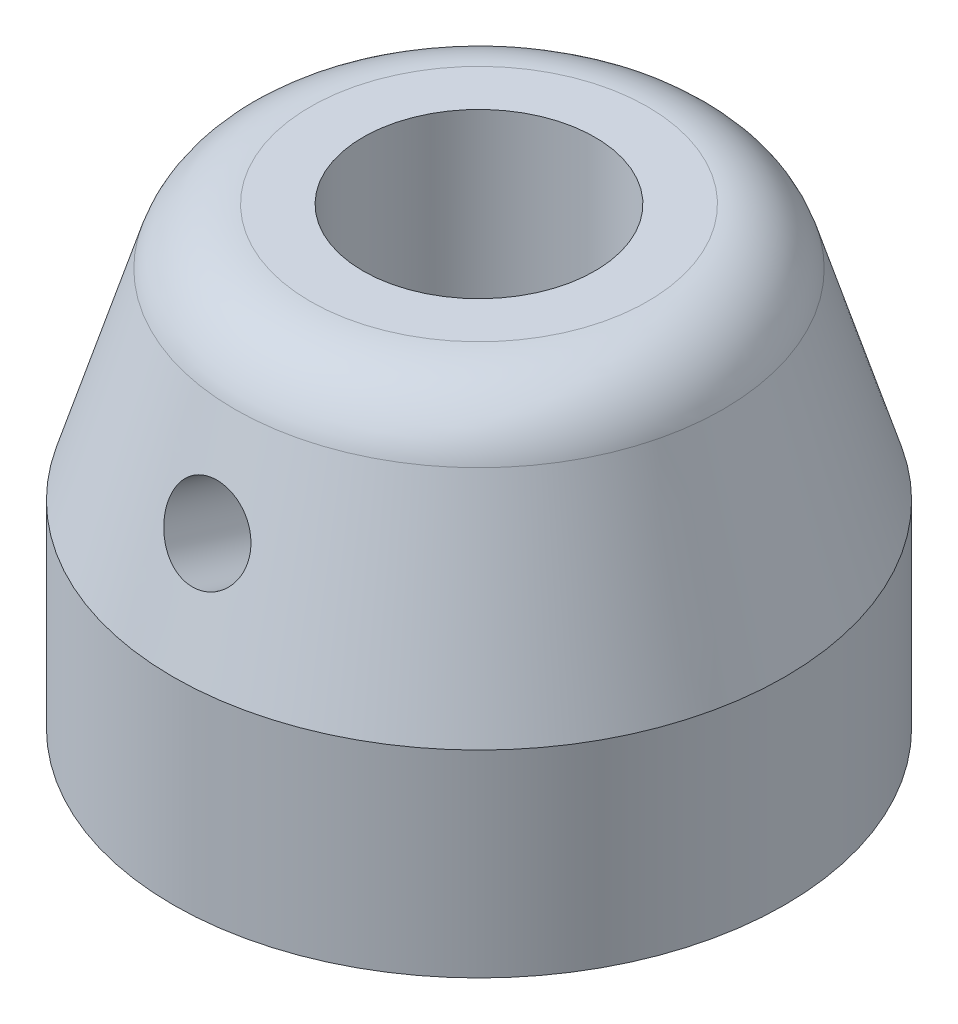
ISO-10303-21;
HEADER;
FILE_DESCRIPTION(('STEP AP214'),'2;1');
FILE_NAME('part.step','',(''),(''),'','','');
FILE_SCHEMA(('AUTOMOTIVE_DESIGN { 1 0 10303 214 1 1 1 1 }'));
ENDSEC;
DATA;
#1=APPLICATION_CONTEXT('core data for automotive mechanical design processes');
#2=APPLICATION_PROTOCOL_DEFINITION('international standard','automotive_design',2000,#1);
#3=PRODUCT_CONTEXT('',#1,'mechanical');
#4=PRODUCT('Part','Part','',(#3));
#5=PRODUCT_RELATED_PRODUCT_CATEGORY('part','',(#4));
#6=PRODUCT_DEFINITION_FORMATION('','',#4);
#7=PRODUCT_DEFINITION_CONTEXT('part definition',#1,'design');
#8=PRODUCT_DEFINITION('design','',#6,#7);
#9=PRODUCT_DEFINITION_SHAPE('','',#8);
#10=(LENGTH_UNIT() NAMED_UNIT(*) SI_UNIT(.MILLI.,.METRE.));
#11=(NAMED_UNIT(*) PLANE_ANGLE_UNIT() SI_UNIT($,.RADIAN.));
#12=(NAMED_UNIT(*) SI_UNIT($,.STERADIAN.) SOLID_ANGLE_UNIT());
#13=UNCERTAINTY_MEASURE_WITH_UNIT(LENGTH_MEASURE(1.E-05),#10,'distance_accuracy_value','');
#14=(GEOMETRIC_REPRESENTATION_CONTEXT(3) GLOBAL_UNCERTAINTY_ASSIGNED_CONTEXT((#13)) GLOBAL_UNIT_ASSIGNED_CONTEXT((#10,
#11,#12)) REPRESENTATION_CONTEXT('',''));
#15=CARTESIAN_POINT('',(0.,0.,0.));
#16=DIRECTION('',(0.,0.,1.));
#17=DIRECTION('',(1.,0.,0.));
#18=AXIS2_PLACEMENT_3D('',#15,#16,#17);
#19=CARTESIAN_POINT('',(0.,46.,0.));
#20=DIRECTION('',(0.,1.,0.));
#21=DIRECTION('',(0.,0.,1.));
#22=AXIS2_PLACEMENT_3D('',#19,#20,#21);
#23=CYLINDRICAL_SURFACE('',#22,31.);
#24=CARTESIAN_POINT('',(0.,20.,0.));
#25=DIRECTION('',(0.,1.,0.));
#26=DIRECTION('',(0.,0.,1.));
#27=AXIS2_PLACEMENT_3D('',#24,#25,#26);
#28=CIRCLE('',#27,31.);
#29=CARTESIAN_POINT('',(0.,20.,31.));
#30=VERTEX_POINT('',#29);
#31=EDGE_CURVE('E88',#30,#30,#28,.T.);
#32=ORIENTED_EDGE('',*,*,#31,.F.);
#33=EDGE_LOOP('',(#32));
#34=FACE_BOUND('',#33,.T.);
#35=CARTESIAN_POINT('',(0.,0.,0.));
#36=DIRECTION('',(0.,1.,0.));
#37=DIRECTION('',(0.,0.,1.));
#38=AXIS2_PLACEMENT_3D('',#35,#36,#37);
#39=CIRCLE('',#38,31.);
#40=CARTESIAN_POINT('',(0.,0.,31.));
#41=VERTEX_POINT('',#40);
#42=EDGE_CURVE('E71',#41,#41,#39,.T.);
#43=ORIENTED_EDGE('',*,*,#42,.T.);
#44=EDGE_LOOP('',(#43));
#45=FACE_BOUND('',#44,.T.);
#46=ADVANCED_FACE('F44',(#34,#45),#23,.T.);
#47=CARTESIAN_POINT('',(0.,20.,0.));
#48=DIRECTION('',(0.,-1.,0.));
#49=DIRECTION('',(0.,0.,-1.));
#50=AXIS2_PLACEMENT_3D('',#47,#48,#49);
#51=CONICAL_SURFACE('',#50,31.,0.298498931586179);
#52=CARTESIAN_POINT('',(-2.47896857256019,27.4266641210964,28.6076671889577));
#53=CARTESIAN_POINT('',(-2.67871040352838,27.5475384324813,28.5530258268327));
#54=CARTESIAN_POINT('',(-2.86736227669643,27.6842583789864,28.4922638951279));
#55=CARTESIAN_POINT('',(-3.21710296310663,27.9859200023431,28.3614912180417));
#56=CARTESIAN_POINT('',(-3.37816257160851,28.1508912167663,28.2914708102778));
#57=CARTESIAN_POINT('',(-3.66802363541882,28.5047648526583,28.1455531413542));
#58=CARTESIAN_POINT('',(-3.7968351058711,28.6936598167344,28.0696577143805));
#59=CARTESIAN_POINT('',(-4.01853937684838,29.0905021738753,27.915421285237));
#60=CARTESIAN_POINT('',(-4.11144115088781,29.2984447910136,27.8370808993358));
#61=CARTESIAN_POINT('',(-4.25841202590599,29.7272308993035,27.6814998032547));
#62=CARTESIAN_POINT('',(-4.31259897396648,29.9480330078038,27.604256463415));
#63=CARTESIAN_POINT('',(-4.3809515533205,30.3970207321406,27.4536034299304));
#64=CARTESIAN_POINT('',(-4.39511843552809,30.6252061169711,27.3801936165307));
#65=CARTESIAN_POINT('',(-4.3830459196184,31.0802691147423,27.2403178189752));
#66=CARTESIAN_POINT('',(-4.35718624502968,31.3071387721845,27.1737928891051));
#67=CARTESIAN_POINT('',(-4.266540005477,31.7551944926889,27.0486130112945));
#68=CARTESIAN_POINT('',(-4.20175367034798,31.9763805893006,26.9899580168899));
#69=CARTESIAN_POINT('',(-4.03524152634335,32.4064689357755,26.8815433083788));
#70=CARTESIAN_POINT('',(-3.93354546171424,32.6153809198492,26.8317764796624));
#71=CARTESIAN_POINT('',(-3.69611978237815,33.0150532276893,26.7413706784069));
#72=CARTESIAN_POINT('',(-3.56038802258449,33.2058124063364,26.70073228149));
#73=CARTESIAN_POINT('',(-3.25721618270502,33.5652958955681,26.6279846142463));
#74=CARTESIAN_POINT('',(-3.0894872947086,33.7337938098088,26.59595998353));
#75=CARTESIAN_POINT('',(-2.72780268640914,34.0414932316436,26.5403116565402));
#76=CARTESIAN_POINT('',(-2.53384605334922,34.1806937192209,26.5166882527434));
#77=CARTESIAN_POINT('',(-2.12404153803911,34.4260247936023,26.4769352686362));
#78=CARTESIAN_POINT('',(-1.90809260942371,34.5319926865776,26.4608423715075));
#79=CARTESIAN_POINT('',(-1.46116931141975,34.7064307785364,26.4355248001239));
#80=CARTESIAN_POINT('',(-1.23019586273256,34.7749032728176,26.4262997054409));
#81=CARTESIAN_POINT('',(-0.761747829856679,34.8716106227682,26.4141639202516));
#82=CARTESIAN_POINT('',(-0.524340410534713,34.9001644297117,26.4112030792416));
#83=CARTESIAN_POINT('',(-0.0481046763356252,34.9170682939925,26.4111620229872));
#84=CARTESIAN_POINT('',(0.190723562851325,34.9054204741482,26.4140814972334));
#85=CARTESIAN_POINT('',(0.660994343596139,34.8425911813642,26.4258202697552));
#86=CARTESIAN_POINT('',(0.892480942100044,34.7917295939299,26.4345917527917));
#87=CARTESIAN_POINT('',(1.34357624541333,34.6525802889507,26.4583768844912));
#88=CARTESIAN_POINT('',(1.56318453225184,34.5642912553836,26.4733907526482));
#89=CARTESIAN_POINT('',(1.98552281665762,34.3526385299844,26.5103840637217));
#90=CARTESIAN_POINT('',(2.18816347414168,34.2291026432675,26.5323977655822));
#91=CARTESIAN_POINT('',(2.56981865105906,33.9510262386237,26.5841178479365));
#92=CARTESIAN_POINT('',(2.74883159539706,33.7964836554249,26.6138247408912));
#93=CARTESIAN_POINT('',(3.08000562981805,33.4593974181625,26.6819545538937));
#94=CARTESIAN_POINT('',(3.2318802018564,33.2765891272637,26.7204616897325));
#95=CARTESIAN_POINT('',(3.50226361866395,32.8896439320262,26.8064462240075));
#96=CARTESIAN_POINT('',(3.62077276660633,32.6855072215101,26.8539235409301));
#97=CARTESIAN_POINT('',(3.82088920354866,32.2621956503547,26.9577401201206));
#98=CARTESIAN_POINT('',(3.90253006307413,32.0430346804306,27.0140712572441));
#99=CARTESIAN_POINT('',(4.02660722530236,31.5960427080011,27.1349062790825));
#100=CARTESIAN_POINT('',(4.06904622853319,31.3682123038395,27.1994096004856));
#101=CARTESIAN_POINT('',(4.11320504439022,30.9128917546639,27.3344505588576));
#102=CARTESIAN_POINT('',(4.11532488926308,30.6854206829957,27.4049219375907));
#103=CARTESIAN_POINT('',(4.07981510710137,30.2350581203578,27.5503219084929));
#104=CARTESIAN_POINT('',(4.04218611559537,30.0121665562263,27.6252504293805));
#105=CARTESIAN_POINT('',(3.92848843606647,29.5777371984061,27.7766528864498));
#106=CARTESIAN_POINT('',(3.8525298656313,29.3661687894058,27.8531217963807));
#107=CARTESIAN_POINT('',(3.66445028021999,28.9592634365836,28.0047606910264));
#108=CARTESIAN_POINT('',(3.55232732722918,28.7639273633429,28.0799306059018));
#109=CARTESIAN_POINT('',(3.29401295482158,28.3929157631036,28.2263409404663));
#110=CARTESIAN_POINT('',(3.14754721362027,28.2174163618131,28.2975436829587));
#111=CARTESIAN_POINT('',(2.82514566215157,27.8923708488063,28.4320520702882));
#112=CARTESIAN_POINT('',(2.64920852642426,27.7428259049939,28.4953573597183));
#113=CARTESIAN_POINT('',(2.27146329914998,27.4725458332606,28.6113840154168));
#114=CARTESIAN_POINT('',(2.06949258004591,27.3520067671253,28.6640329917397));
#115=CARTESIAN_POINT('',(1.64626184415688,27.1441290129422,28.7555155271441));
#116=CARTESIAN_POINT('',(1.42500298754789,27.0567883297127,28.7943499164563));
#117=CARTESIAN_POINT('',(0.970524002874922,26.9179201190584,28.8559909682918));
#118=CARTESIAN_POINT('',(0.737363378964454,26.8662301984568,28.8788703131739));
#119=CARTESIAN_POINT('',(0.264790133052555,26.7994036949937,28.9076300645711));
#120=CARTESIAN_POINT('',(0.0253766362459706,26.7842722548199,28.9135080795292));
#121=CARTESIAN_POINT('',(-0.45079453912458,26.7909519277466,28.9079349180397));
#122=CARTESIAN_POINT('',(-0.68755816908644,26.8124693262623,28.896621596268));
#123=CARTESIAN_POINT('',(-1.15347618737422,26.8913075858918,28.8574956860142));
#124=CARTESIAN_POINT('',(-1.382637702046,26.9485938570412,28.8296990388867));
#125=CARTESIAN_POINT('',(-1.75842351677215,27.0743867846228,28.7699962752195));
#126=CARTESIAN_POINT('',(-1.90872569103317,27.1339996598006,28.7419943732019));
#127=CARTESIAN_POINT('',(-2.2007351655404,27.2688287103132,28.6795038858341));
#128=CARTESIAN_POINT('',(-2.34244242810093,27.3440449540569,28.6450152720446));
#129=CARTESIAN_POINT('',(-2.47896857256019,27.4266641210964,28.6076671889577));
#130=B_SPLINE_CURVE_WITH_KNOTS('',3,(#52,#53,#54,#55,#56,#57,#58,#59,#60,#61,#62,#63,#64,#65,
#66,#67,#68,#69,#70,#71,#72,#73,#74,#75,#76,#77,#78,#79,#80,#81,#82,#83,#84,#85,#86,#87,#88,#89,
#90,#91,#92,#93,#94,#95,#96,#97,#98,#99,#100,#101,#102,#103,#104,#105,#106,#107,#108,#109,#110,
#111,#112,#113,#114,#115,#116,#117,#118,#119,#120,#121,#122,#123,#124,#125,#126,#127,#128,#129),
.UNSPECIFIED.,.T.,.F.,(4,2,2,2,2,2,2,2,2,2,2,2,2,2,2,2,2,2,2,2,2,2,2,2,2,2,2,2,2,2,2,2,2,2,2,2,
2,2,4),(0.,0.718736089669873,1.43822827992346,2.15749674309746,2.87658535108715,
3.59347563397114,4.31034350864452,5.02045217484688,5.73055664839126,6.44009013984241,
7.14966836061522,7.86598340082185,8.58232337606713,9.3021174203046,10.0218673970997,
10.7358330331358,11.4497609693018,12.1579258829266,12.8661156990812,13.5778263504156,
14.2895844226127,15.0084623724072,15.7273337899438,16.4455493106654,17.163715351438,
17.8747522478453,18.5857777759344,19.2947721205896,20.0038044658877,20.718705878871,
21.4336394527927,22.1532777179565,22.8728727269117,23.5891678593486,24.305563747276,
25.0162452050284,25.7262404668636,26.2175037967047,26.708769280408),.UNSPECIFIED.);
#131=CARTESIAN_POINT('',(-2.47896857256019,27.4266641210964,28.6076671889577));
#132=VERTEX_POINT('',#131);
#133=EDGE_CURVE('E11',#132,#132,#130,.T.);
#134=ORIENTED_EDGE('',*,*,#133,.T.);
#135=EDGE_LOOP('',(#134));
#136=FACE_BOUND('',#135,.T.);
#137=CARTESIAN_POINT('',(0.,40.3526867907002,0.));
#138=DIRECTION('',(0.,1.,0.));
#139=DIRECTION('',(0.,0.,1.));
#140=AXIS2_PLACEMENT_3D('',#137,#138,#139);
#141=CIRCLE('',#140,24.7376348336307);
#142=CARTESIAN_POINT('',(0.,40.3526867907002,24.7376348336307));
#143=VERTEX_POINT('',#142);
#144=EDGE_CURVE('E57',#143,#143,#141,.F.);
#145=ORIENTED_EDGE('',*,*,#144,.T.);
#146=EDGE_LOOP('',(#145));
#147=FACE_BOUND('',#146,.T.);
#148=ORIENTED_EDGE('',*,*,#31,.T.);
#149=EDGE_LOOP('',(#148));
#150=FACE_BOUND('',#149,.T.);
#151=ADVANCED_FACE('F100',(#136,#147,#150),#51,.T.);
#152=CARTESIAN_POINT('',(23.,46.,0.));
#153=DIRECTION('',(0.,-1.,0.));
#154=DIRECTION('',(0.,0.,-1.));
#155=AXIS2_PLACEMENT_3D('',#152,#153,#154);
#156=PLANE('',#155);
#157=CARTESIAN_POINT('',(0.,46.,0.));
#158=DIRECTION('',(0.,1.,0.));
#159=DIRECTION('',(0.,0.,1.));
#160=AXIS2_PLACEMENT_3D('',#157,#158,#159);
#161=CIRCLE('',#160,11.75);
#162=CARTESIAN_POINT('',(0.,46.,11.75));
#163=VERTEX_POINT('',#162);
#164=EDGE_CURVE('E81',#163,#163,#161,.T.);
#165=ORIENTED_EDGE('',*,*,#164,.F.);
#166=EDGE_LOOP('',(#165));
#167=FACE_BOUND('',#166,.T.);
#168=CARTESIAN_POINT('',(0.,46.,0.));
#169=DIRECTION('',(0.,-1.,0.));
#170=DIRECTION('',(0.,0.,-1.));
#171=AXIS2_PLACEMENT_3D('',#168,#169,#170);
#172=CIRCLE('',#171,17.0914027638551);
#173=CARTESIAN_POINT('',(0.,46.,-17.0914027638551));
#174=VERTEX_POINT('',#173);
#175=EDGE_CURVE('E92',#174,#174,#172,.F.);
#176=ORIENTED_EDGE('',*,*,#175,.T.);
#177=EDGE_LOOP('',(#176));
#178=FACE_BOUND('',#177,.T.);
#179=ADVANCED_FACE('F108',(#167,#178),#156,.F.);
#180=CARTESIAN_POINT('',(0.,-46.,0.));
#181=DIRECTION('',(0.,1.,0.));
#182=DIRECTION('',(-1.,0.,0.));
#183=AXIS2_PLACEMENT_3D('',#180,#181,#182);
#184=SPHERICAL_SURFACE('',#183,50.);
#185=CARTESIAN_POINT('',(0.,2.59976851796726,0.));
#186=DIRECTION('',(0.,-1.,0.));
#187=DIRECTION('',(0.,0.,-1.));
#188=AXIS2_PLACEMENT_3D('',#185,#186,#187);
#189=CIRCLE('',#188,11.75);
#190=CARTESIAN_POINT('',(-11.7499999999999,2.59976851796726,0.));
#191=VERTEX_POINT('',#190);
#192=EDGE_CURVE('E72',#191,#191,#189,.F.);
#193=CARTESIAN_POINT('',(0.,0.,0.));
#194=DIRECTION('',(0.,1.,0.));
#195=DIRECTION('',(0.,0.,1.));
#196=AXIS2_PLACEMENT_3D('',#193,#194,#195);
#197=CIRCLE('',#196,19.5959179422654);
#198=CARTESIAN_POINT('',(-19.5959179422654,0.,0.));
#199=VERTEX_POINT('',#198);
#200=EDGE_CURVE('E78',#199,#199,#197,.T.);
#201=CARTESIAN_POINT('',(-11.7499999999999,2.59976851796726,0.));
#202=CARTESIAN_POINT('',(-11.8337825961571,2.57951234334302,0.));
#203=CARTESIAN_POINT('',(-11.9175128109634,2.5590395116493,0.));
#204=CARTESIAN_POINT('',(-12.0848662405702,2.51766109084595,0.));
#205=CARTESIAN_POINT('',(-12.1684894553706,2.4967555017363,0.));
#206=CARTESIAN_POINT('',(-12.3356266476615,2.45451212282406,0.));
#207=CARTESIAN_POINT('',(-12.4191406251518,2.43317433302147,0.));
#208=CARTESIAN_POINT('',(-12.586057109207,2.39006712410812,0.));
#209=CARTESIAN_POINT('',(-12.6694596157717,2.36829770499737,0.));
#210=CARTESIAN_POINT('',(-12.8361509271361,2.32432781956634,0.));
#211=CARTESIAN_POINT('',(-12.9194397319358,2.30212735324606,0.));
#212=CARTESIAN_POINT('',(-13.0859014120269,2.2572959672467,0.));
#213=CARTESIAN_POINT('',(-13.1690742873183,2.23466504756761,0.));
#214=CARTESIAN_POINT('',(-13.3353018837357,2.18897336015513,0.));
#215=CARTESIAN_POINT('',(-13.4183566048618,2.16591259242175,0.));
#216=CARTESIAN_POINT('',(-13.5843456714555,2.11936182571849,0.));
#217=CARTESIAN_POINT('',(-13.6672800169233,2.09587182674862,0.));
#218=CARTESIAN_POINT('',(-13.8330261139263,2.04846322586671,0.));
#219=CARTESIAN_POINT('',(-13.9158378654616,2.02454462395467,0.));
#220=CARTESIAN_POINT('',(-14.0813365596049,1.97627945694788,0.));
#221=CARTESIAN_POINT('',(-14.1640235022129,1.95193289185313,0.));
#222=CARTESIAN_POINT('',(-14.329270366845,1.90281244968697,0.));
#223=CARTESIAN_POINT('',(-14.4118302888691,1.87803857261556,0.));
#224=CARTESIAN_POINT('',(-14.5768209040742,1.82806416913164,0.));
#225=CARTESIAN_POINT('',(-14.6592515972552,1.80286364271913,0.));
#226=CARTESIAN_POINT('',(-14.8239815499716,1.75203661460033,0.));
#227=CARTESIAN_POINT('',(-14.9062808095069,1.72641011289403,0.));
#228=CARTESIAN_POINT('',(-15.0707456936449,1.67473181962865,0.));
#229=CARTESIAN_POINT('',(-15.1529113182474,1.64868002806957,0.));
#230=CARTESIAN_POINT('',(-15.3171067348071,1.59615185191502,0.));
#231=CARTESIAN_POINT('',(-15.3991365267642,1.56967546731956,0.));
#232=CARTESIAN_POINT('',(-15.5630580839533,1.51629881326535,0.));
#233=CARTESIAN_POINT('',(-15.6449498491854,1.48939854380662,0.));
#234=CARTESIAN_POINT('',(-15.8085931625367,1.43517483953681,0.));
#235=CARTESIAN_POINT('',(-15.8903447106559,1.40785140472574,0.));
#236=CARTESIAN_POINT('',(-16.0537054031444,1.35278210058074,0.));
#237=CARTESIAN_POINT('',(-16.1353145475136,1.32503623124681,0.));
#238=CARTESIAN_POINT('',(-16.2983882496736,1.26912280018456,0.));
#239=CARTESIAN_POINT('',(-16.3798528074644,1.24095523845624,0.));
#240=CARTESIAN_POINT('',(-16.5426351575066,1.18419917601287,0.));
#241=CARTESIAN_POINT('',(-16.623952949758,1.15561067529781,0.));
#242=CARTESIAN_POINT('',(-16.7864395936858,1.09801349954758,0.));
#243=CARTESIAN_POINT('',(-16.8676084453623,1.0690048245124,0.));
#244=CARTESIAN_POINT('',(-17.0297950370886,1.01056807602713,0.));
#245=CARTESIAN_POINT('',(-17.1108127771384,0.981140002577039,0.));
#246=CARTESIAN_POINT('',(-17.2726949786017,0.921865244384898,0.));
#247=CARTESIAN_POINT('',(-17.3535594400151,0.89201855964285,0.));
#248=CARTESIAN_POINT('',(-17.5151329212954,0.831907377186585,0.));
#249=CARTESIAN_POINT('',(-17.5958419411623,0.801642879472368,0.));
#250=CARTESIAN_POINT('',(-17.7571023805971,0.740696880566653,0.));
#251=CARTESIAN_POINT('',(-17.837653800165,0.710015379375155,0.));
#252=CARTESIAN_POINT('',(-17.9985968844652,0.648236194164592,0.));
#253=CARTESIAN_POINT('',(-18.0789885491975,0.617138510145528,0.));
#254=CARTESIAN_POINT('',(-18.239609973561,0.554527791057258,0.));
#255=CARTESIAN_POINT('',(-18.3198397331923,0.523014755988051,0.));
#256=CARTESIAN_POINT('',(-18.4801352014253,0.459574177701666,0.));
#257=CARTESIAN_POINT('',(-18.5602009100271,0.427646634484487,0.));
#258=CARTESIAN_POINT('',(-18.720166134637,0.363377893834624,0.));
#259=CARTESIAN_POINT('',(-18.8000656506451,0.33103669640194,0.));
#260=CARTESIAN_POINT('',(-18.9596963530372,0.265941512529208,0.));
#261=CARTESIAN_POINT('',(-19.0394275394212,0.23318752608916,0.));
#262=CARTESIAN_POINT('',(-19.1987194497059,0.167267639661525,0.));
#263=CARTESIAN_POINT('',(-19.2782801736066,0.134101739673936,0.));
#264=CARTESIAN_POINT('',(-19.4372290318615,0.0673589155744214,0.));
#265=CARTESIAN_POINT('',(-19.5166171662158,0.033781991462495,0.));
#266=CARTESIAN_POINT('',(-19.5959179422654,0.,0.));
#267=B_SPLINE_CURVE_WITH_KNOTS('',3,(#201,#202,#203,#204,#205,#206,#207,#208,#209,#210,#211,
#212,#213,#214,#215,#216,#217,#218,#219,#220,#221,#222,#223,#224,#225,#226,#227,#228,#229,#230,
#231,#232,#233,#234,#235,#236,#237,#238,#239,#240,#241,#242,#243,#244,#245,#246,#247,#248,#249,
#250,#251,#252,#253,#254,#255,#256,#257,#258,#259,#260,#261,#262,#263,#264,#265,#266),
.UNSPECIFIED.,.F.,.F.,(4,2,2,2,2,2,2,2,2,2,2,2,2,2,2,2,2,2,2,2,2,2,2,2,2,2,2,2,2,2,2,2,4),(0.,
0.258589201630696,0.517178403261402,0.775767604892109,1.03435680652281,1.2929460081535,
1.55153520978421,1.81012441141491,2.06871361304561,2.3273028146763,2.58589201630701,
2.84448121793772,3.10307041956841,3.36165962119911,3.62024882282981,3.87883802446052,
4.13742722609121,4.39601642772191,4.65460562935262,4.91319483098332,5.17178403261402,
5.43037323424471,5.68896243587542,5.94755163750612,6.20614083913682,6.46473004076752,
6.72331924239822,6.98190844402893,7.24049764565962,7.49908684729032,7.75767604892103,
8.01626525055173,8.27485445218243),.UNSPECIFIED.);
#268=EDGE_CURVE('BSEAM110',#191,#199,#267,.T.);
#269=ORIENTED_EDGE('',*,*,#192,.T.);
#270=ORIENTED_EDGE('',*,*,#200,.F.);
#271=ORIENTED_EDGE('',*,*,#268,.T.);
#272=ORIENTED_EDGE('',*,*,#268,.F.);
#273=EDGE_LOOP('',(#269,#271,#270,#272));
#274=FACE_BOUND('',#273,.T.);
#275=ADVANCED_FACE('F110',(#274),#184,.F.);
#276=CARTESIAN_POINT('',(19.5959179422654,0.,0.));
#277=DIRECTION('',(0.,1.,0.));
#278=DIRECTION('',(0.,0.,1.));
#279=AXIS2_PLACEMENT_3D('',#276,#277,#278);
#280=PLANE('',#279);
#281=ORIENTED_EDGE('',*,*,#42,.F.);
#282=EDGE_LOOP('',(#281));
#283=FACE_BOUND('',#282,.T.);
#284=ORIENTED_EDGE('',*,*,#200,.T.);
#285=EDGE_LOOP('',(#284));
#286=FACE_BOUND('',#285,.T.);
#287=ADVANCED_FACE('F105',(#283,#286),#280,.F.);
#288=CARTESIAN_POINT('',(0.,38.,0.));
#289=DIRECTION('',(0.,-1.,0.));
#290=DIRECTION('',(0.,0.,-1.));
#291=AXIS2_PLACEMENT_3D('',#288,#289,#290);
#292=TOROIDAL_SURFACE('',#291,17.0914027638551,8.);
#293=ORIENTED_EDGE('',*,*,#144,.F.);
#294=EDGE_LOOP('',(#293));
#295=FACE_BOUND('',#294,.T.);
#296=ORIENTED_EDGE('',*,*,#175,.F.);
#297=EDGE_LOOP('',(#296));
#298=FACE_BOUND('',#297,.T.);
#299=ADVANCED_FACE('F46',(#295,#298),#292,.T.);
#300=CARTESIAN_POINT('',(-0.142010421998061,30.8492283588282,27.6614113596183));
#301=DIRECTION('',(-0.00490679199004557,0.294085848837523,0.955766413359394));
#302=DIRECTION('',(0.,-0.955777919373626,0.29408938919625));
#303=AXIS2_PLACEMENT_3D('',#300,#301,#302);
#304=CYLINDRICAL_SURFACE('',#303,4.25);
#305=CARTESIAN_POINT('',(-0.092942502097605,27.9083698704529,18.1037472260244));
#306=DIRECTION('',(-0.00490679199004557,0.294085848837523,0.955766413359394));
#307=DIRECTION('',(0.,-0.955777919373626,0.29408938919625));
#308=AXIS2_PLACEMENT_3D('',#305,#306,#307);
#309=CIRCLE('',#308,4.25);
#310=CARTESIAN_POINT('',(-0.092942502097605,23.846313713115,19.3536271301084));
#311=VERTEX_POINT('',#310);
#312=EDGE_CURVE('E68',#311,#311,#309,.T.);
#313=ORIENTED_EDGE('',*,*,#312,.F.);
#314=EDGE_LOOP('',(#313));
#315=FACE_BOUND('',#314,.T.);
#316=ORIENTED_EDGE('',*,*,#133,.F.);
#317=EDGE_LOOP('',(#316));
#318=FACE_BOUND('',#317,.T.);
#319=ADVANCED_FACE('F64',(#315,#318),#304,.F.);
#320=CARTESIAN_POINT('',(-0.092942502097605,27.9083698704529,18.1037472260244));
#321=DIRECTION('',(-0.00490679199004557,0.294085848837523,0.955766413359394));
#322=DIRECTION('',(0.,-0.955777919373626,0.29408938919625));
#323=AXIS2_PLACEMENT_3D('',#320,#321,#322);
#324=CONICAL_SURFACE('',#323,4.25,1.02974425867665);
#325=CARTESIAN_POINT('',(-0.0804122352891496,27.157375298439,15.6630470312226));
#326=VERTEX_POINT('',#325);
#327=VERTEX_LOOP('',#326);
#328=FACE_BOUND('',#327,.T.);
#329=ORIENTED_EDGE('',*,*,#312,.T.);
#330=EDGE_LOOP('',(#329));
#331=FACE_BOUND('',#330,.T.);
#332=ADVANCED_FACE('F60',(#328,#331),#324,.F.);
#333=CARTESIAN_POINT('',(0.,46.,0.));
#334=DIRECTION('',(0.,1.,0.));
#335=DIRECTION('',(0.,0.,1.));
#336=AXIS2_PLACEMENT_3D('',#333,#334,#335);
#337=CYLINDRICAL_SURFACE('',#336,11.75);
#338=ORIENTED_EDGE('',*,*,#164,.T.);
#339=EDGE_LOOP('',(#338));
#340=FACE_BOUND('',#339,.T.);
#341=ORIENTED_EDGE('',*,*,#192,.F.);
#342=EDGE_LOOP('',(#341));
#343=FACE_BOUND('',#342,.T.);
#344=ADVANCED_FACE('F63',(#340,#343),#337,.F.);
#345=CLOSED_SHELL('',(#46,#151,#179,#275,#287,#299,#319,#332,#344));
#346=MANIFOLD_SOLID_BREP('B2',#345);
#347=ADVANCED_BREP_SHAPE_REPRESENTATION('',(#18,#346),#14);
#348=SHAPE_DEFINITION_REPRESENTATION(#9,#347);
ENDSEC;
END-ISO-10303-21;
